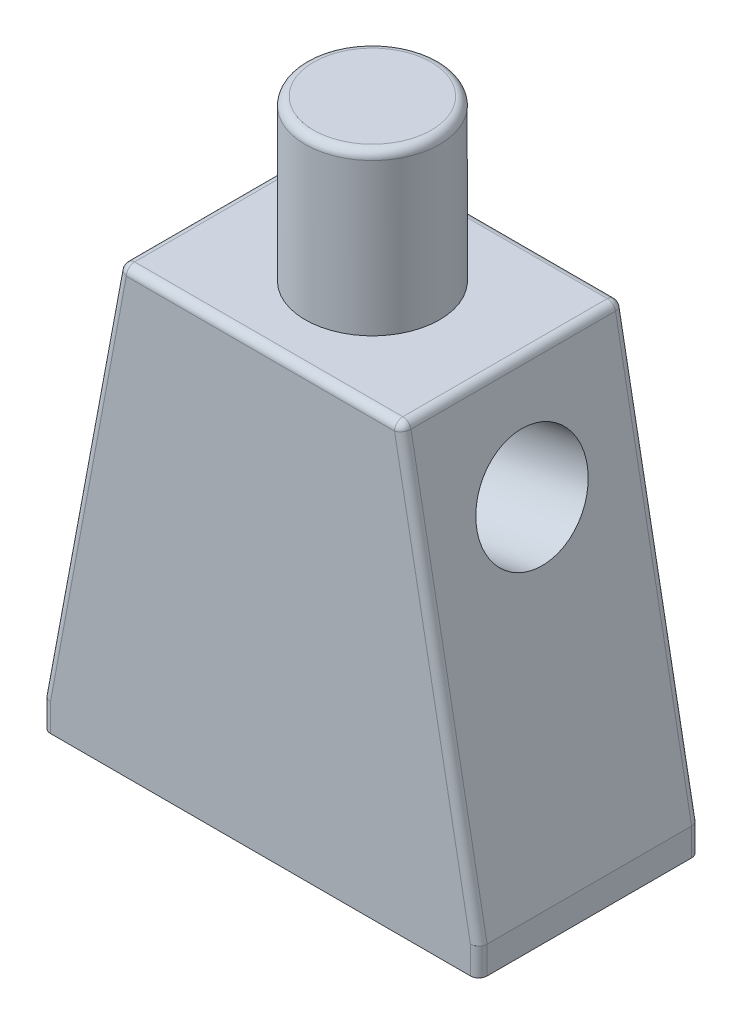
ISO-10303-21;
HEADER;
FILE_DESCRIPTION(('STEP AP214'),'2;1');
FILE_NAME('part.step','',(''),(''),'','','');
FILE_SCHEMA(('AUTOMOTIVE_DESIGN { 1 0 10303 214 1 1 1 1 }'));
ENDSEC;
DATA;
#1=APPLICATION_CONTEXT('core data for automotive mechanical design processes');
#2=APPLICATION_PROTOCOL_DEFINITION('international standard','automotive_design',2000,#1);
#3=PRODUCT_CONTEXT('',#1,'mechanical');
#4=PRODUCT('Part','Part','',(#3));
#5=PRODUCT_RELATED_PRODUCT_CATEGORY('part','',(#4));
#6=PRODUCT_DEFINITION_FORMATION('','',#4);
#7=PRODUCT_DEFINITION_CONTEXT('part definition',#1,'design');
#8=PRODUCT_DEFINITION('design','',#6,#7);
#9=PRODUCT_DEFINITION_SHAPE('','',#8);
#10=(LENGTH_UNIT() NAMED_UNIT(*) SI_UNIT(.MILLI.,.METRE.));
#11=(NAMED_UNIT(*) PLANE_ANGLE_UNIT() SI_UNIT($,.RADIAN.));
#12=(NAMED_UNIT(*) SI_UNIT($,.STERADIAN.) SOLID_ANGLE_UNIT());
#13=UNCERTAINTY_MEASURE_WITH_UNIT(LENGTH_MEASURE(1.E-05),#10,'distance_accuracy_value','');
#14=(GEOMETRIC_REPRESENTATION_CONTEXT(3) GLOBAL_UNCERTAINTY_ASSIGNED_CONTEXT((#13)) GLOBAL_UNIT_ASSIGNED_CONTEXT((#10,
#11,#12)) REPRESENTATION_CONTEXT('',''));
#15=CARTESIAN_POINT('',(0.,0.,0.));
#16=DIRECTION('',(0.,0.,1.));
#17=DIRECTION('',(1.,0.,0.));
#18=AXIS2_PLACEMENT_3D('',#15,#16,#17);
#19=CARTESIAN_POINT('',(200.66,-267.037594936709,203.2));
#20=DIRECTION('',(-0.98302024876546,-0.183497113102886,0.));
#21=DIRECTION('',(0.183497113102886,-0.98302024876546,0.));
#22=AXIS2_PLACEMENT_3D('',#19,#20,#21);
#23=PLANE('',#22);
#24=CARTESIAN_POINT('',(147.946452395732,15.3564100861572,101.6));
#25=DIRECTION('',(0.98302024876546,0.183497113102886,0.));
#26=DIRECTION('',(-0.183497113102886,0.98302024876546,0.));
#27=AXIS2_PLACEMENT_3D('',#24,#25,#26);
#28=CIRCLE('',#27,50.8);
#29=CARTESIAN_POINT('',(138.624799050105,65.2938387234426,101.6));
#30=VERTEX_POINT('',#29);
#31=EDGE_CURVE('E315',#30,#30,#28,.T.);
#32=ORIENTED_EDGE('',*,*,#31,.F.);
#33=EDGE_LOOP('',(#32));
#34=FACE_BOUND('',#33,.T.);
#35=DIRECTION('',(0.,0.,-1.));
#36=VECTOR('',#35,1.);
#37=CARTESIAN_POINT('',(200.66,-267.037594936709,203.2));
#38=LINE('',#37,#36);
#39=CARTESIAN_POINT('',(200.66,-267.037594936709,195.58));
#40=VERTEX_POINT('',#39);
#41=CARTESIAN_POINT('',(200.66,-267.037594936709,7.61999999999999));
#42=VERTEX_POINT('',#41);
#43=EDGE_CURVE('E240',#40,#42,#38,.T.);
#44=ORIENTED_EDGE('',*,*,#43,.T.);
#45=DIRECTION('',(-0.183497113102886,0.98302024876546,0.));
#46=VECTOR('',#45,1.);
#47=CARTESIAN_POINT('',(200.66,-267.037594936709,7.61999999999999));
#48=LINE('',#47,#46);
#49=CARTESIAN_POINT('',(130.701393706322,107.740653065135,7.61999999999999));
#50=VERTEX_POINT('',#49);
#51=EDGE_CURVE('E336',#42,#50,#48,.T.);
#52=ORIENTED_EDGE('',*,*,#51,.T.);
#53=DIRECTION('',(0.,0.,-1.));
#54=VECTOR('',#53,1.);
#55=CARTESIAN_POINT('',(130.701393706322,107.740653065135,203.2));
#56=LINE('',#55,#54);
#57=CARTESIAN_POINT('',(130.701393706322,107.740653065135,195.58));
#58=VERTEX_POINT('',#57);
#59=EDGE_CURVE('E331',#50,#58,#56,.F.);
#60=ORIENTED_EDGE('',*,*,#59,.T.);
#61=DIRECTION('',(-0.183497113102886,0.98302024876546,0.));
#62=VECTOR('',#61,1.);
#63=CARTESIAN_POINT('',(200.66,-267.037594936709,195.58));
#64=LINE('',#63,#62);
#65=EDGE_CURVE('E333',#58,#40,#64,.F.);
#66=ORIENTED_EDGE('',*,*,#65,.T.);
#67=EDGE_LOOP('',(#44,#52,#60,#66));
#68=FACE_BOUND('',#67,.T.);
#69=ADVANCED_FACE('F33',(#34,#68),#23,.F.);
#70=CARTESIAN_POINT('',(129.54,113.962405063291,203.2));
#71=DIRECTION('',(0.,-1.,0.));
#72=DIRECTION('',(1.,0.,0.));
#73=AXIS2_PLACEMENT_3D('',#70,#71,#72);
#74=PLANE('',#73);
#75=CARTESIAN_POINT('',(1.29077941072965,113.962405063291,101.591800301564));
#76=DIRECTION('',(0.,-1.,0.));
#77=DIRECTION('',(1.,0.,0.));
#78=AXIS2_PLACEMENT_3D('',#75,#76,#77);
#79=CIRCLE('',#78,61.722);
#80=CARTESIAN_POINT('',(63.0127794107296,113.962405063291,101.591800301564));
#81=VERTEX_POINT('',#80);
#82=EDGE_CURVE('E206',#81,#81,#79,.F.);
#83=ORIENTED_EDGE('',*,*,#82,.F.);
#84=EDGE_LOOP('',(#83));
#85=FACE_BOUND('',#84,.T.);
#86=DIRECTION('',(-1.,0.,0.));
#87=VECTOR('',#86,1.);
#88=CARTESIAN_POINT('',(129.54,113.962405063291,195.58));
#89=LINE('',#88,#87);
#90=CARTESIAN_POINT('',(-123.21077941073,113.962405063291,195.58));
#91=VERTEX_POINT('',#90);
#92=CARTESIAN_POINT('',(123.21077941073,113.962405063291,195.58));
#93=VERTEX_POINT('',#92);
#94=EDGE_CURVE('E197',#91,#93,#89,.F.);
#95=ORIENTED_EDGE('',*,*,#94,.T.);
#96=DIRECTION('',(0.,0.,-1.));
#97=VECTOR('',#96,1.);
#98=CARTESIAN_POINT('',(123.21077941073,113.962405063291,203.2));
#99=LINE('',#98,#97);
#100=CARTESIAN_POINT('',(123.21077941073,113.962405063291,7.61999999999999));
#101=VERTEX_POINT('',#100);
#102=EDGE_CURVE('E203',#93,#101,#99,.T.);
#103=ORIENTED_EDGE('',*,*,#102,.T.);
#104=DIRECTION('',(-1.,0.,0.));
#105=VECTOR('',#104,1.);
#106=CARTESIAN_POINT('',(129.54,113.962405063291,7.61999999999999));
#107=LINE('',#106,#105);
#108=CARTESIAN_POINT('',(-123.21077941073,113.962405063291,7.61999999999999));
#109=VERTEX_POINT('',#108);
#110=EDGE_CURVE('E201',#101,#109,#107,.T.);
#111=ORIENTED_EDGE('',*,*,#110,.T.);
#112=DIRECTION('',(0.,0.,-1.));
#113=VECTOR('',#112,1.);
#114=CARTESIAN_POINT('',(-123.21077941073,113.962405063291,203.2));
#115=LINE('',#114,#113);
#116=EDGE_CURVE('E199',#109,#91,#115,.F.);
#117=ORIENTED_EDGE('',*,*,#116,.T.);
#118=EDGE_LOOP('',(#95,#103,#111,#117));
#119=FACE_BOUND('',#118,.T.);
#120=ADVANCED_FACE('F394',(#85,#119),#74,.F.);
#121=CARTESIAN_POINT('',(-129.54,113.962405063291,203.2));
#122=DIRECTION('',(0.98302024876546,-0.183497113102886,0.));
#123=DIRECTION('',(0.183497113102886,0.98302024876546,0.));
#124=AXIS2_PLACEMENT_3D('',#121,#122,#123);
#125=PLANE('',#124);
#126=CARTESIAN_POINT('',(-147.946452395732,15.3564100861572,101.6));
#127=DIRECTION('',(-0.98302024876546,0.183497113102886,0.));
#128=DIRECTION('',(-0.183497113102886,-0.98302024876546,0.));
#129=AXIS2_PLACEMENT_3D('',#126,#127,#128);
#130=CIRCLE('',#129,50.8);
#131=CARTESIAN_POINT('',(-157.268105741358,-34.5810185511282,101.6));
#132=VERTEX_POINT('',#131);
#133=EDGE_CURVE('E304',#132,#132,#130,.T.);
#134=ORIENTED_EDGE('',*,*,#133,.F.);
#135=EDGE_LOOP('',(#134));
#136=FACE_BOUND('',#135,.T.);
#137=DIRECTION('',(0.,0.,-1.));
#138=VECTOR('',#137,1.);
#139=CARTESIAN_POINT('',(-130.701393706322,107.740653065135,203.2));
#140=LINE('',#139,#138);
#141=CARTESIAN_POINT('',(-130.701393706322,107.740653065135,195.58));
#142=VERTEX_POINT('',#141);
#143=CARTESIAN_POINT('',(-130.701393706322,107.740653065135,7.61999999999999));
#144=VERTEX_POINT('',#143);
#145=EDGE_CURVE('E191',#142,#144,#140,.T.);
#146=ORIENTED_EDGE('',*,*,#145,.T.);
#147=DIRECTION('',(-0.183497113102886,-0.98302024876546,0.));
#148=VECTOR('',#147,1.);
#149=CARTESIAN_POINT('',(-129.54,113.962405063291,7.61999999999999));
#150=LINE('',#149,#148);
#151=CARTESIAN_POINT('',(-200.66,-267.037594936709,7.61999999999999));
#152=VERTEX_POINT('',#151);
#153=EDGE_CURVE('E195',#144,#152,#150,.T.);
#154=ORIENTED_EDGE('',*,*,#153,.T.);
#155=DIRECTION('',(0.,0.,-1.));
#156=VECTOR('',#155,1.);
#157=CARTESIAN_POINT('',(-200.66,-267.037594936709,203.2));
#158=LINE('',#157,#156);
#159=CARTESIAN_POINT('',(-200.66,-267.037594936709,195.58));
#160=VERTEX_POINT('',#159);
#161=EDGE_CURVE('E329',#160,#152,#158,.T.);
#162=ORIENTED_EDGE('',*,*,#161,.F.);
#163=DIRECTION('',(-0.183497113102886,-0.98302024876546,0.));
#164=VECTOR('',#163,1.);
#165=CARTESIAN_POINT('',(-129.54,113.962405063291,195.58));
#166=LINE('',#165,#164);
#167=EDGE_CURVE('E193',#160,#142,#166,.F.);
#168=ORIENTED_EDGE('',*,*,#167,.T.);
#169=EDGE_LOOP('',(#146,#154,#162,#168));
#170=FACE_BOUND('',#169,.T.);
#171=ADVANCED_FACE('F400',(#136,#170),#125,.F.);
#172=CARTESIAN_POINT('',(0.,0.,203.2));
#173=DIRECTION('',(0.,0.,1.));
#174=DIRECTION('',(1.,0.,0.));
#175=AXIS2_PLACEMENT_3D('',#172,#173,#174);
#176=PLANE('',#175);
#177=DIRECTION('',(-1.,0.,0.));
#178=VECTOR('',#177,1.);
#179=CARTESIAN_POINT('',(-200.66,-292.437594936709,203.2));
#180=LINE('',#179,#178);
#181=CARTESIAN_POINT('',(193.04,-292.437594936709,203.2));
#182=VERTEX_POINT('',#181);
#183=CARTESIAN_POINT('',(-193.04,-292.437594936709,203.2));
#184=VERTEX_POINT('',#183);
#185=EDGE_CURVE('E301',#182,#184,#180,.T.);
#186=ORIENTED_EDGE('',*,*,#185,.F.);
#187=DIRECTION('',(0.,1.,0.));
#188=VECTOR('',#187,1.);
#189=CARTESIAN_POINT('',(193.04,-267.037594936709,203.2));
#190=LINE('',#189,#188);
#191=CARTESIAN_POINT('',(193.04,-267.037594936709,203.2));
#192=VERTEX_POINT('',#191);
#193=EDGE_CURVE('E268',#182,#192,#190,.T.);
#194=ORIENTED_EDGE('',*,*,#193,.T.);
#195=DIRECTION('',(-1.,0.,0.));
#196=VECTOR('',#195,1.);
#197=CARTESIAN_POINT('',(-200.66,-267.037594936709,203.2));
#198=LINE('',#197,#196);
#199=CARTESIAN_POINT('',(192.90837941073,-267.037594936709,203.2));
#200=VERTEX_POINT('',#199);
#201=EDGE_CURVE('E310',#192,#200,#198,.T.);
#202=ORIENTED_EDGE('',*,*,#201,.T.);
#203=DIRECTION('',(-0.183497113102886,0.98302024876546,0.));
#204=VECTOR('',#203,1.);
#205=CARTESIAN_POINT('',(122.049385704407,112.564157061447,203.2));
#206=LINE('',#205,#204);
#207=CARTESIAN_POINT('',(123.21077941073,106.342405063291,203.2));
#208=VERTEX_POINT('',#207);
#209=EDGE_CURVE('E189',#200,#208,#206,.T.);
#210=ORIENTED_EDGE('',*,*,#209,.T.);
#211=DIRECTION('',(-1.,0.,0.));
#212=VECTOR('',#211,1.);
#213=CARTESIAN_POINT('',(-129.54,106.342405063291,203.2));
#214=LINE('',#213,#212);
#215=CARTESIAN_POINT('',(-123.21077941073,106.342405063291,203.2));
#216=VERTEX_POINT('',#215);
#217=EDGE_CURVE('E185',#208,#216,#214,.T.);
#218=ORIENTED_EDGE('',*,*,#217,.T.);
#219=DIRECTION('',(-0.183497113102886,-0.98302024876546,0.));
#220=VECTOR('',#219,1.);
#221=CARTESIAN_POINT('',(-193.169385704407,-268.435842938553,203.2));
#222=LINE('',#221,#220);
#223=CARTESIAN_POINT('',(-192.90837941073,-267.037594936709,203.2));
#224=VERTEX_POINT('',#223);
#225=EDGE_CURVE('E187',#216,#224,#222,.T.);
#226=ORIENTED_EDGE('',*,*,#225,.T.);
#227=CARTESIAN_POINT('',(-193.04,-267.037594936709,203.2));
#228=VERTEX_POINT('',#227);
#229=EDGE_CURVE('E156',#224,#228,#198,.T.);
#230=ORIENTED_EDGE('',*,*,#229,.T.);
#231=DIRECTION('',(0.,1.,0.));
#232=VECTOR('',#231,1.);
#233=CARTESIAN_POINT('',(-193.04,-292.437594936709,203.2));
#234=LINE('',#233,#232);
#235=EDGE_CURVE('E266',#228,#184,#234,.F.);
#236=ORIENTED_EDGE('',*,*,#235,.T.);
#237=EDGE_LOOP('',(#186,#194,#202,#210,#218,#226,#230,#236));
#238=FACE_BOUND('',#237,.T.);
#239=ADVANCED_FACE('F363',(#238),#176,.T.);
#240=CARTESIAN_POINT('',(0.,0.,0.));
#241=DIRECTION('',(0.,0.,1.));
#242=DIRECTION('',(1.,0.,0.));
#243=AXIS2_PLACEMENT_3D('',#240,#241,#242);
#244=PLANE('',#243);
#245=DIRECTION('',(1.,0.,0.));
#246=VECTOR('',#245,1.);
#247=CARTESIAN_POINT('',(-200.66,-292.437594936709,0.));
#248=LINE('',#247,#246);
#249=CARTESIAN_POINT('',(-193.04,-292.437594936709,0.));
#250=VERTEX_POINT('',#249);
#251=CARTESIAN_POINT('',(193.04,-292.437594936709,0.));
#252=VERTEX_POINT('',#251);
#253=EDGE_CURVE('E296',#250,#252,#248,.T.);
#254=ORIENTED_EDGE('',*,*,#253,.F.);
#255=DIRECTION('',(0.,1.,0.));
#256=VECTOR('',#255,1.);
#257=CARTESIAN_POINT('',(-193.04,0.,0.));
#258=LINE('',#257,#256);
#259=CARTESIAN_POINT('',(-193.04,-267.037594936709,0.));
#260=VERTEX_POINT('',#259);
#261=EDGE_CURVE('E153',#250,#260,#258,.T.);
#262=ORIENTED_EDGE('',*,*,#261,.T.);
#263=DIRECTION('',(1.,0.,0.));
#264=VECTOR('',#263,1.);
#265=CARTESIAN_POINT('',(-200.66,-267.037594936709,0.));
#266=LINE('',#265,#264);
#267=CARTESIAN_POINT('',(-192.90837941073,-267.037594936709,0.));
#268=VERTEX_POINT('',#267);
#269=EDGE_CURVE('E146',#260,#268,#266,.T.);
#270=ORIENTED_EDGE('',*,*,#269,.T.);
#271=DIRECTION('',(-0.183497113102886,-0.98302024876546,0.));
#272=VECTOR('',#271,1.);
#273=CARTESIAN_POINT('',(-138.244315324138,25.8056055271725,0.));
#274=LINE('',#273,#272);
#275=CARTESIAN_POINT('',(-123.21077941073,106.342405063291,0.));
#276=VERTEX_POINT('',#275);
#277=EDGE_CURVE('E150',#268,#276,#274,.F.);
#278=ORIENTED_EDGE('',*,*,#277,.T.);
#279=DIRECTION('',(-1.,0.,0.));
#280=VECTOR('',#279,1.);
#281=CARTESIAN_POINT('',(0.,106.342405063291,0.));
#282=LINE('',#281,#280);
#283=CARTESIAN_POINT('',(123.21077941073,106.342405063291,0.));
#284=VERTEX_POINT('',#283);
#285=EDGE_CURVE('E169',#276,#284,#282,.F.);
#286=ORIENTED_EDGE('',*,*,#285,.T.);
#287=DIRECTION('',(-0.183497113102886,0.98302024876546,0.));
#288=VECTOR('',#287,1.);
#289=CARTESIAN_POINT('',(138.244315324138,25.8056055271725,0.));
#290=LINE('',#289,#288);
#291=CARTESIAN_POINT('',(192.90837941073,-267.037594936709,0.));
#292=VERTEX_POINT('',#291);
#293=EDGE_CURVE('E168',#284,#292,#290,.F.);
#294=ORIENTED_EDGE('',*,*,#293,.T.);
#295=CARTESIAN_POINT('',(193.04,-267.037594936709,0.));
#296=VERTEX_POINT('',#295);
#297=EDGE_CURVE('E157',#292,#296,#266,.T.);
#298=ORIENTED_EDGE('',*,*,#297,.T.);
#299=DIRECTION('',(0.,1.,0.));
#300=VECTOR('',#299,1.);
#301=CARTESIAN_POINT('',(193.04,0.,0.));
#302=LINE('',#301,#300);
#303=EDGE_CURVE('E249',#296,#252,#302,.F.);
#304=ORIENTED_EDGE('',*,*,#303,.T.);
#305=EDGE_LOOP('',(#254,#262,#270,#278,#286,#294,#298,#304));
#306=FACE_BOUND('',#305,.T.);
#307=ADVANCED_FACE('F149',(#306),#244,.F.);
#308=CARTESIAN_POINT('',(-138.244315324138,25.8056055271725,195.58));
#309=DIRECTION('',(0.183497113102886,0.98302024876546,0.));
#310=DIRECTION('',(-0.98302024876546,0.183497113102886,0.));
#311=AXIS2_PLACEMENT_3D('',#308,#309,#310);
#312=CYLINDRICAL_SURFACE('',#311,7.62);
#313=CARTESIAN_POINT('',(-123.21077941073,106.342405063291,195.58));
#314=DIRECTION('',(0.183497113102885,0.98302024876546,0.));
#315=DIRECTION('',(-0.98302024876546,0.183497113102885,0.));
#316=AXIS2_PLACEMENT_3D('',#313,#314,#315);
#317=CIRCLE('',#316,7.62);
#318=EDGE_CURVE('E237',#142,#216,#317,.T.);
#319=ORIENTED_EDGE('',*,*,#318,.F.);
#320=ORIENTED_EDGE('',*,*,#167,.F.);
#321=CARTESIAN_POINT('',(-192.90837941073,-267.037594936709,195.58));
#322=DIRECTION('',(0.,1.,0.));
#323=DIRECTION('',(1.,0.,0.));
#324=AXIS2_PLACEMENT_3D('',#321,#322,#323);
#325=ELLIPSE('',#324,7.75162058927035,7.62);
#326=EDGE_CURVE('E175',#224,#160,#325,.F.);
#327=ORIENTED_EDGE('',*,*,#326,.F.);
#328=ORIENTED_EDGE('',*,*,#225,.F.);
#329=EDGE_LOOP('',(#319,#320,#327,#328));
#330=FACE_BOUND('',#329,.T.);
#331=ADVANCED_FACE('F440',(#330),#312,.T.);
#332=CARTESIAN_POINT('',(-123.21077941073,106.342405063291,195.58));
#333=DIRECTION('',(0.,0.,1.));
#334=DIRECTION('',(1.,0.,0.));
#335=AXIS2_PLACEMENT_3D('',#332,#333,#334);
#336=SPHERICAL_SURFACE('',#335,7.62);
#337=CARTESIAN_POINT('',(-123.21077941073,106.342405063291,195.58));
#338=DIRECTION('',(0.,0.,1.));
#339=DIRECTION('',(1.,0.,0.));
#340=AXIS2_PLACEMENT_3D('',#337,#338,#339);
#341=CIRCLE('',#340,7.62);
#342=EDGE_CURVE('E231',#142,#91,#341,.F.);
#343=ORIENTED_EDGE('',*,*,#342,.F.);
#344=ORIENTED_EDGE('',*,*,#318,.T.);
#345=CARTESIAN_POINT('',(-123.21077941073,106.342405063291,195.58));
#346=DIRECTION('',(-1.,0.,0.));
#347=DIRECTION('',(0.,0.,1.));
#348=AXIS2_PLACEMENT_3D('',#345,#346,#347);
#349=CIRCLE('',#348,7.62);
#350=EDGE_CURVE('E234',#91,#216,#349,.F.);
#351=ORIENTED_EDGE('',*,*,#350,.F.);
#352=EDGE_LOOP('',(#343,#344,#351));
#353=FACE_BOUND('',#352,.T.);
#354=ADVANCED_FACE('F436',(#353),#336,.T.);
#355=CARTESIAN_POINT('',(138.244315324138,25.8056055271725,195.58));
#356=DIRECTION('',(0.183497113102886,-0.98302024876546,0.));
#357=DIRECTION('',(0.98302024876546,0.183497113102886,0.));
#358=AXIS2_PLACEMENT_3D('',#355,#356,#357);
#359=CYLINDRICAL_SURFACE('',#358,7.62);
#360=CARTESIAN_POINT('',(192.90837941073,-267.037594936709,195.58));
#361=DIRECTION('',(0.,1.,0.));
#362=DIRECTION('',(1.,0.,0.));
#363=AXIS2_PLACEMENT_3D('',#360,#361,#362);
#364=ELLIPSE('',#363,7.75162058927035,7.62);
#365=EDGE_CURVE('E174',#40,#200,#364,.F.);
#366=ORIENTED_EDGE('',*,*,#365,.F.);
#367=ORIENTED_EDGE('',*,*,#65,.F.);
#368=CARTESIAN_POINT('',(123.21077941073,106.342405063291,195.58));
#369=DIRECTION('',(-0.183497113102883,0.98302024876546,0.));
#370=DIRECTION('',(-0.98302024876546,-0.183497113102883,0.));
#371=AXIS2_PLACEMENT_3D('',#368,#369,#370);
#372=CIRCLE('',#371,7.62);
#373=EDGE_CURVE('E228',#208,#58,#372,.T.);
#374=ORIENTED_EDGE('',*,*,#373,.F.);
#375=ORIENTED_EDGE('',*,*,#209,.F.);
#376=EDGE_LOOP('',(#366,#367,#374,#375));
#377=FACE_BOUND('',#376,.T.);
#378=ADVANCED_FACE('F432',(#377),#359,.T.);
#379=CARTESIAN_POINT('',(0.,106.342405063291,195.58));
#380=DIRECTION('',(1.,0.,0.));
#381=DIRECTION('',(0.,1.,0.));
#382=AXIS2_PLACEMENT_3D('',#379,#380,#381);
#383=CYLINDRICAL_SURFACE('',#382,7.62);
#384=ORIENTED_EDGE('',*,*,#350,.T.);
#385=ORIENTED_EDGE('',*,*,#217,.F.);
#386=CARTESIAN_POINT('',(123.21077941073,106.342405063291,195.58));
#387=DIRECTION('',(1.,0.,0.));
#388=DIRECTION('',(0.,0.,-1.));
#389=AXIS2_PLACEMENT_3D('',#386,#387,#388);
#390=CIRCLE('',#389,7.62);
#391=EDGE_CURVE('E225',#93,#208,#390,.T.);
#392=ORIENTED_EDGE('',*,*,#391,.F.);
#393=ORIENTED_EDGE('',*,*,#94,.F.);
#394=EDGE_LOOP('',(#384,#385,#392,#393));
#395=FACE_BOUND('',#394,.T.);
#396=ADVANCED_FACE('F428',(#395),#383,.T.);
#397=CARTESIAN_POINT('',(-123.21077941073,106.342405063291,203.2));
#398=DIRECTION('',(0.,0.,-1.));
#399=DIRECTION('',(-1.,0.,0.));
#400=AXIS2_PLACEMENT_3D('',#397,#398,#399);
#401=CYLINDRICAL_SURFACE('',#400,7.62);
#402=ORIENTED_EDGE('',*,*,#342,.T.);
#403=ORIENTED_EDGE('',*,*,#116,.F.);
#404=CARTESIAN_POINT('',(-123.21077941073,106.342405063291,7.61999999999999));
#405=DIRECTION('',(0.,0.,-1.));
#406=DIRECTION('',(-1.,0.,0.));
#407=AXIS2_PLACEMENT_3D('',#404,#405,#406);
#408=CIRCLE('',#407,7.62);
#409=EDGE_CURVE('E222',#144,#109,#408,.T.);
#410=ORIENTED_EDGE('',*,*,#409,.F.);
#411=ORIENTED_EDGE('',*,*,#145,.F.);
#412=EDGE_LOOP('',(#402,#403,#410,#411));
#413=FACE_BOUND('',#412,.T.);
#414=ADVANCED_FACE('F425',(#413),#401,.T.);
#415=CARTESIAN_POINT('',(-122.049385704407,112.564157061447,7.61999999999999));
#416=DIRECTION('',(-0.183497113102886,-0.98302024876546,0.));
#417=DIRECTION('',(0.98302024876546,-0.183497113102886,0.));
#418=AXIS2_PLACEMENT_3D('',#415,#416,#417);
#419=CYLINDRICAL_SURFACE('',#418,7.62);
#420=CARTESIAN_POINT('',(-192.90837941073,-267.037594936709,7.61999999999999));
#421=DIRECTION('',(0.,1.,0.));
#422=DIRECTION('',(-1.,0.,0.));
#423=AXIS2_PLACEMENT_3D('',#420,#421,#422);
#424=ELLIPSE('',#423,7.75162058927035,7.62);
#425=EDGE_CURVE('E163',#152,#268,#424,.F.);
#426=ORIENTED_EDGE('',*,*,#425,.F.);
#427=ORIENTED_EDGE('',*,*,#153,.F.);
#428=CARTESIAN_POINT('',(-123.21077941073,106.342405063291,7.62));
#429=DIRECTION('',(0.183497113102886,0.98302024876546,0.));
#430=DIRECTION('',(-0.98302024876546,0.183497113102886,0.));
#431=AXIS2_PLACEMENT_3D('',#428,#429,#430);
#432=CIRCLE('',#431,7.62);
#433=EDGE_CURVE('E166',#276,#144,#432,.T.);
#434=ORIENTED_EDGE('',*,*,#433,.F.);
#435=ORIENTED_EDGE('',*,*,#277,.F.);
#436=EDGE_LOOP('',(#426,#427,#434,#435));
#437=FACE_BOUND('',#436,.T.);
#438=ADVANCED_FACE('F161',(#437),#419,.T.);
#439=CARTESIAN_POINT('',(123.21077941073,106.342405063291,195.58));
#440=DIRECTION('',(0.,0.,1.));
#441=DIRECTION('',(1.,0.,0.));
#442=AXIS2_PLACEMENT_3D('',#439,#440,#441);
#443=SPHERICAL_SURFACE('',#442,7.62);
#444=ORIENTED_EDGE('',*,*,#391,.T.);
#445=ORIENTED_EDGE('',*,*,#373,.T.);
#446=CARTESIAN_POINT('',(123.21077941073,106.342405063291,195.58));
#447=DIRECTION('',(0.,0.,1.));
#448=DIRECTION('',(1.,0.,0.));
#449=AXIS2_PLACEMENT_3D('',#446,#447,#448);
#450=CIRCLE('',#449,7.62);
#451=EDGE_CURVE('E218',#93,#58,#450,.F.);
#452=ORIENTED_EDGE('',*,*,#451,.F.);
#453=EDGE_LOOP('',(#444,#445,#452));
#454=FACE_BOUND('',#453,.T.);
#455=ADVANCED_FACE('F418',(#454),#443,.T.);
#456=CARTESIAN_POINT('',(-123.21077941073,106.342405063291,7.62));
#457=DIRECTION('',(0.,0.,1.));
#458=DIRECTION('',(1.,0.,0.));
#459=AXIS2_PLACEMENT_3D('',#456,#457,#458);
#460=SPHERICAL_SURFACE('',#459,7.62);
#461=ORIENTED_EDGE('',*,*,#433,.T.);
#462=ORIENTED_EDGE('',*,*,#409,.T.);
#463=CARTESIAN_POINT('',(-123.21077941073,106.342405063291,7.61999999999999));
#464=DIRECTION('',(-1.,0.,0.));
#465=DIRECTION('',(0.,0.,1.));
#466=AXIS2_PLACEMENT_3D('',#463,#464,#465);
#467=CIRCLE('',#466,7.62);
#468=EDGE_CURVE('E215',#276,#109,#467,.F.);
#469=ORIENTED_EDGE('',*,*,#468,.F.);
#470=EDGE_LOOP('',(#461,#462,#469));
#471=FACE_BOUND('',#470,.T.);
#472=ADVANCED_FACE('F415',(#471),#460,.T.);
#473=CARTESIAN_POINT('',(123.21077941073,106.342405063291,203.2));
#474=DIRECTION('',(0.,0.,-1.));
#475=DIRECTION('',(-1.,0.,0.));
#476=AXIS2_PLACEMENT_3D('',#473,#474,#475);
#477=CYLINDRICAL_SURFACE('',#476,7.62);
#478=ORIENTED_EDGE('',*,*,#451,.T.);
#479=ORIENTED_EDGE('',*,*,#59,.F.);
#480=CARTESIAN_POINT('',(123.21077941073,106.342405063291,7.61999999999999));
#481=DIRECTION('',(0.,0.,-1.));
#482=DIRECTION('',(-1.,0.,0.));
#483=AXIS2_PLACEMENT_3D('',#480,#481,#482);
#484=CIRCLE('',#483,7.62);
#485=EDGE_CURVE('E212',#101,#50,#484,.T.);
#486=ORIENTED_EDGE('',*,*,#485,.F.);
#487=ORIENTED_EDGE('',*,*,#102,.F.);
#488=EDGE_LOOP('',(#478,#479,#486,#487));
#489=FACE_BOUND('',#488,.T.);
#490=ADVANCED_FACE('F354',(#489),#477,.T.);
#491=CARTESIAN_POINT('',(129.54,106.342405063291,7.61999999999999));
#492=DIRECTION('',(-1.,0.,0.));
#493=DIRECTION('',(0.,-1.,0.));
#494=AXIS2_PLACEMENT_3D('',#491,#492,#493);
#495=CYLINDRICAL_SURFACE('',#494,7.62);
#496=ORIENTED_EDGE('',*,*,#468,.T.);
#497=ORIENTED_EDGE('',*,*,#110,.F.);
#498=CARTESIAN_POINT('',(123.21077941073,106.342405063291,7.62));
#499=DIRECTION('',(1.,0.,0.));
#500=DIRECTION('',(0.,0.,-1.));
#501=AXIS2_PLACEMENT_3D('',#498,#499,#500);
#502=CIRCLE('',#501,7.62);
#503=EDGE_CURVE('E209',#284,#101,#502,.T.);
#504=ORIENTED_EDGE('',*,*,#503,.F.);
#505=ORIENTED_EDGE('',*,*,#285,.F.);
#506=EDGE_LOOP('',(#496,#497,#504,#505));
#507=FACE_BOUND('',#506,.T.);
#508=ADVANCED_FACE('F343',(#507),#495,.T.);
#509=CARTESIAN_POINT('',(123.21077941073,106.342405063291,7.62));
#510=DIRECTION('',(0.,0.,1.));
#511=DIRECTION('',(1.,0.,0.));
#512=AXIS2_PLACEMENT_3D('',#509,#510,#511);
#513=SPHERICAL_SURFACE('',#512,7.62);
#514=ORIENTED_EDGE('',*,*,#503,.T.);
#515=ORIENTED_EDGE('',*,*,#485,.T.);
#516=CARTESIAN_POINT('',(123.21077941073,106.342405063291,7.61999999999999));
#517=DIRECTION('',(-0.183497113102885,0.98302024876546,0.));
#518=DIRECTION('',(-0.98302024876546,-0.183497113102885,0.));
#519=AXIS2_PLACEMENT_3D('',#516,#517,#518);
#520=CIRCLE('',#519,7.62);
#521=EDGE_CURVE('E207',#284,#50,#520,.F.);
#522=ORIENTED_EDGE('',*,*,#521,.F.);
#523=EDGE_LOOP('',(#514,#515,#522));
#524=FACE_BOUND('',#523,.T.);
#525=ADVANCED_FACE('F350',(#524),#513,.T.);
#526=CARTESIAN_POINT('',(193.169385704407,-268.435842938553,7.61999999999999));
#527=DIRECTION('',(-0.183497113102886,0.98302024876546,0.));
#528=DIRECTION('',(-0.98302024876546,-0.183497113102886,0.));
#529=AXIS2_PLACEMENT_3D('',#526,#527,#528);
#530=CYLINDRICAL_SURFACE('',#529,7.62);
#531=CARTESIAN_POINT('',(192.90837941073,-267.037594936709,7.61999999999999));
#532=DIRECTION('',(0.,1.,0.));
#533=DIRECTION('',(-1.,0.,0.));
#534=AXIS2_PLACEMENT_3D('',#531,#532,#533);
#535=ELLIPSE('',#534,7.75162058927035,7.62);
#536=EDGE_CURVE('E178',#292,#42,#535,.F.);
#537=ORIENTED_EDGE('',*,*,#536,.F.);
#538=ORIENTED_EDGE('',*,*,#293,.F.);
#539=ORIENTED_EDGE('',*,*,#521,.T.);
#540=ORIENTED_EDGE('',*,*,#51,.F.);
#541=EDGE_LOOP('',(#537,#538,#539,#540));
#542=FACE_BOUND('',#541,.T.);
#543=ADVANCED_FACE('F348',(#542),#530,.T.);
#544=CARTESIAN_POINT('',(1.29077941072962,261.104605063291,101.591800301564));
#545=DIRECTION('',(0.,-1.,0.));
#546=DIRECTION('',(1.,0.,0.));
#547=AXIS2_PLACEMENT_3D('',#544,#545,#546);
#548=CYLINDRICAL_SURFACE('',#547,61.722);
#549=CARTESIAN_POINT('',(1.29077941072962,253.484605063291,101.591800301564));
#550=DIRECTION('',(0.,1.,0.));
#551=DIRECTION('',(-1.,0.,0.));
#552=AXIS2_PLACEMENT_3D('',#549,#550,#551);
#553=CIRCLE('',#552,61.722);
#554=CARTESIAN_POINT('',(-60.4312205892704,253.484605063291,101.591800301564));
#555=VERTEX_POINT('',#554);
#556=EDGE_CURVE('E246',#555,#555,#553,.F.);
#557=ORIENTED_EDGE('',*,*,#556,.T.);
#558=EDGE_LOOP('',(#557));
#559=FACE_BOUND('',#558,.T.);
#560=ORIENTED_EDGE('',*,*,#82,.T.);
#561=EDGE_LOOP('',(#560));
#562=FACE_BOUND('',#561,.T.);
#563=ADVANCED_FACE('F408',(#559,#562),#548,.T.);
#564=CARTESIAN_POINT('',(1.29077941072962,261.104605063291,101.591800301564));
#565=DIRECTION('',(0.,1.,0.));
#566=DIRECTION('',(-1.,0.,0.));
#567=AXIS2_PLACEMENT_3D('',#564,#565,#566);
#568=PLANE('',#567);
#569=CARTESIAN_POINT('',(1.29077941072962,261.104605063291,101.591800301564));
#570=DIRECTION('',(0.,1.,0.));
#571=DIRECTION('',(-1.,0.,0.));
#572=AXIS2_PLACEMENT_3D('',#569,#570,#571);
#573=CIRCLE('',#572,54.102);
#574=CARTESIAN_POINT('',(-52.8112205892704,261.104605063291,101.591800301564));
#575=VERTEX_POINT('',#574);
#576=EDGE_CURVE('E243',#575,#575,#573,.T.);
#577=ORIENTED_EDGE('',*,*,#576,.T.);
#578=EDGE_LOOP('',(#577));
#579=FACE_BOUND('',#578,.T.);
#580=ADVANCED_FACE('F449',(#579),#568,.T.);
#581=CARTESIAN_POINT('',(1.29077941072962,253.484605063291,101.591800301564));
#582=DIRECTION('',(0.,1.,0.));
#583=DIRECTION('',(-1.,0.,0.));
#584=AXIS2_PLACEMENT_3D('',#581,#582,#583);
#585=TOROIDAL_SURFACE('',#584,54.102,7.62);
#586=ORIENTED_EDGE('',*,*,#556,.F.);
#587=EDGE_LOOP('',(#586));
#588=FACE_BOUND('',#587,.T.);
#589=ORIENTED_EDGE('',*,*,#576,.F.);
#590=EDGE_LOOP('',(#589));
#591=FACE_BOUND('',#590,.T.);
#592=ADVANCED_FACE('F445',(#588,#591),#585,.T.);
#593=CARTESIAN_POINT('',(48.071595121161,-3.28689660509598,101.6));
#594=DIRECTION('',(0.98302024876546,0.183497113102886,0.));
#595=DIRECTION('',(-0.183497113102886,0.98302024876546,0.));
#596=AXIS2_PLACEMENT_3D('',#593,#594,#595);
#597=CYLINDRICAL_SURFACE('',#596,50.8);
#598=CARTESIAN_POINT('',(48.071595121161,-3.28689660509598,101.6));
#599=DIRECTION('',(0.98302024876546,0.183497113102886,0.));
#600=DIRECTION('',(-0.183497113102886,0.98302024876546,0.));
#601=AXIS2_PLACEMENT_3D('',#598,#599,#600);
#602=CIRCLE('',#601,50.8);
#603=CARTESIAN_POINT('',(38.7499417755343,46.6505320321894,101.6));
#604=VERTEX_POINT('',#603);
#605=EDGE_CURVE('E318',#604,#604,#602,.T.);
#606=ORIENTED_EDGE('',*,*,#605,.F.);
#607=EDGE_LOOP('',(#606));
#608=FACE_BOUND('',#607,.T.);
#609=ORIENTED_EDGE('',*,*,#31,.T.);
#610=EDGE_LOOP('',(#609));
#611=FACE_BOUND('',#610,.T.);
#612=ADVANCED_FACE('F448',(#608,#611),#597,.F.);
#613=CARTESIAN_POINT('',(48.071595121161,-3.28689660509598,101.6));
#614=DIRECTION('',(0.98302024876546,0.183497113102886,0.));
#615=DIRECTION('',(-0.183497113102886,0.98302024876546,0.));
#616=AXIS2_PLACEMENT_3D('',#613,#614,#615);
#617=PLANE('',#616);
#618=ORIENTED_EDGE('',*,*,#605,.T.);
#619=EDGE_LOOP('',(#618));
#620=FACE_BOUND('',#619,.T.);
#621=ADVANCED_FACE('F632',(#620),#617,.T.);
#622=CARTESIAN_POINT('',(-48.0715951211609,-3.28689660509604,101.6));
#623=DIRECTION('',(-0.98302024876546,0.183497113102886,0.));
#624=DIRECTION('',(-0.183497113102886,-0.98302024876546,0.));
#625=AXIS2_PLACEMENT_3D('',#622,#623,#624);
#626=CYLINDRICAL_SURFACE('',#625,50.8);
#627=CARTESIAN_POINT('',(-48.0715951211609,-3.28689660509604,101.6));
#628=DIRECTION('',(-0.98302024876546,0.183497113102886,0.));
#629=DIRECTION('',(-0.183497113102886,-0.98302024876546,0.));
#630=AXIS2_PLACEMENT_3D('',#627,#628,#629);
#631=CIRCLE('',#630,50.8);
#632=CARTESIAN_POINT('',(-57.3932484667875,-53.2243252423814,101.6));
#633=VERTEX_POINT('',#632);
#634=EDGE_CURVE('E312',#633,#633,#631,.T.);
#635=ORIENTED_EDGE('',*,*,#634,.F.);
#636=EDGE_LOOP('',(#635));
#637=FACE_BOUND('',#636,.T.);
#638=ORIENTED_EDGE('',*,*,#133,.T.);
#639=EDGE_LOOP('',(#638));
#640=FACE_BOUND('',#639,.T.);
#641=ADVANCED_FACE('F622',(#637,#640),#626,.F.);
#642=CARTESIAN_POINT('',(-48.0715951211609,-3.28689660509604,101.6));
#643=DIRECTION('',(-0.98302024876546,0.183497113102886,0.));
#644=DIRECTION('',(-0.183497113102886,-0.98302024876546,0.));
#645=AXIS2_PLACEMENT_3D('',#642,#643,#644);
#646=PLANE('',#645);
#647=ORIENTED_EDGE('',*,*,#634,.T.);
#648=EDGE_LOOP('',(#647));
#649=FACE_BOUND('',#648,.T.);
#650=ADVANCED_FACE('F533',(#649),#646,.T.);
#651=CARTESIAN_POINT('',(0.,-267.037594936709,0.));
#652=DIRECTION('',(0.,-1.,0.));
#653=DIRECTION('',(0.,0.,-1.));
#654=AXIS2_PLACEMENT_3D('',#651,#652,#653);
#655=PLANE('',#654);
#656=ORIENTED_EDGE('',*,*,#536,.T.);
#657=CARTESIAN_POINT('',(193.04,-267.037594936709,7.61999999999999));
#658=DIRECTION('',(0.,-1.,0.));
#659=DIRECTION('',(0.,0.,-1.));
#660=AXIS2_PLACEMENT_3D('',#657,#658,#659);
#661=CIRCLE('',#660,7.62);
#662=EDGE_CURVE('E41',#42,#296,#661,.F.);
#663=ORIENTED_EDGE('',*,*,#662,.T.);
#664=ORIENTED_EDGE('',*,*,#297,.F.);
#665=EDGE_LOOP('',(#656,#663,#664));
#666=FACE_BOUND('',#665,.T.);
#667=ADVANCED_FACE('F278',(#666),#655,.F.);
#668=ORIENTED_EDGE('',*,*,#201,.F.);
#669=CARTESIAN_POINT('',(193.04,-267.037594936709,195.58));
#670=DIRECTION('',(0.,-1.,0.));
#671=DIRECTION('',(0.,0.,-1.));
#672=AXIS2_PLACEMENT_3D('',#669,#670,#671);
#673=CIRCLE('',#672,7.62);
#674=EDGE_CURVE('E48',#192,#40,#673,.F.);
#675=ORIENTED_EDGE('',*,*,#674,.T.);
#676=ORIENTED_EDGE('',*,*,#365,.T.);
#677=EDGE_LOOP('',(#668,#675,#676));
#678=FACE_BOUND('',#677,.T.);
#679=ADVANCED_FACE('F391',(#678),#655,.F.);
#680=ORIENTED_EDGE('',*,*,#326,.T.);
#681=CARTESIAN_POINT('',(-193.04,-267.037594936709,195.58));
#682=DIRECTION('',(0.,-1.,0.));
#683=DIRECTION('',(0.,0.,-1.));
#684=AXIS2_PLACEMENT_3D('',#681,#682,#683);
#685=CIRCLE('',#684,7.62);
#686=EDGE_CURVE('E11',#160,#228,#685,.F.);
#687=ORIENTED_EDGE('',*,*,#686,.T.);
#688=ORIENTED_EDGE('',*,*,#229,.F.);
#689=EDGE_LOOP('',(#680,#687,#688));
#690=FACE_BOUND('',#689,.T.);
#691=ADVANCED_FACE('F383',(#690),#655,.F.);
#692=CARTESIAN_POINT('',(0.,-292.437594936709,0.));
#693=DIRECTION('',(0.,-1.,0.));
#694=DIRECTION('',(0.,0.,-1.));
#695=AXIS2_PLACEMENT_3D('',#692,#693,#694);
#696=PLANE('',#695);
#697=CARTESIAN_POINT('',(-100.33,-292.437594936709,101.599999999999));
#698=DIRECTION('',(0.,-1.,0.));
#699=DIRECTION('',(0.,0.,-1.));
#700=AXIS2_PLACEMENT_3D('',#697,#698,#699);
#701=CIRCLE('',#700,61.722);
#702=CARTESIAN_POINT('',(-100.33,-292.437594936709,39.8779999999993));
#703=VERTEX_POINT('',#702);
#704=EDGE_CURVE('E285',#703,#703,#701,.T.);
#705=ORIENTED_EDGE('',*,*,#704,.F.);
#706=EDGE_LOOP('',(#705));
#707=FACE_BOUND('',#706,.T.);
#708=DIRECTION('',(0.,0.,-1.));
#709=VECTOR('',#708,1.);
#710=CARTESIAN_POINT('',(-200.66,-292.437594936709,203.2));
#711=LINE('',#710,#709);
#712=CARTESIAN_POINT('',(-200.66,-292.437594936709,195.58));
#713=VERTEX_POINT('',#712);
#714=CARTESIAN_POINT('',(-200.66,-292.437594936709,7.61999999999999));
#715=VERTEX_POINT('',#714);
#716=EDGE_CURVE('E306',#713,#715,#711,.T.);
#717=ORIENTED_EDGE('',*,*,#716,.T.);
#718=CARTESIAN_POINT('',(-193.04,-292.437594936709,7.62));
#719=DIRECTION('',(0.,-1.,0.));
#720=DIRECTION('',(0.,0.,-1.));
#721=AXIS2_PLACEMENT_3D('',#718,#719,#720);
#722=CIRCLE('',#721,7.62);
#723=EDGE_CURVE('E264',#715,#250,#722,.T.);
#724=ORIENTED_EDGE('',*,*,#723,.T.);
#725=ORIENTED_EDGE('',*,*,#253,.T.);
#726=CARTESIAN_POINT('',(193.04,-292.437594936709,7.61999999999999));
#727=DIRECTION('',(0.,-1.,0.));
#728=DIRECTION('',(0.,0.,-1.));
#729=AXIS2_PLACEMENT_3D('',#726,#727,#728);
#730=CIRCLE('',#729,7.62);
#731=CARTESIAN_POINT('',(200.66,-292.437594936709,7.62000000000004));
#732=VERTEX_POINT('',#731);
#733=EDGE_CURVE('E260',#252,#732,#730,.T.);
#734=ORIENTED_EDGE('',*,*,#733,.T.);
#735=DIRECTION('',(0.,0.,1.));
#736=VECTOR('',#735,1.);
#737=CARTESIAN_POINT('',(200.66,-292.437594936709,203.2));
#738=LINE('',#737,#736);
#739=CARTESIAN_POINT('',(200.66,-292.437594936709,195.58));
#740=VERTEX_POINT('',#739);
#741=EDGE_CURVE('E294',#732,#740,#738,.T.);
#742=ORIENTED_EDGE('',*,*,#741,.T.);
#743=CARTESIAN_POINT('',(193.04,-292.437594936709,195.58));
#744=DIRECTION('',(0.,-1.,0.));
#745=DIRECTION('',(0.,0.,-1.));
#746=AXIS2_PLACEMENT_3D('',#743,#744,#745);
#747=CIRCLE('',#746,7.62);
#748=EDGE_CURVE('E262',#740,#182,#747,.T.);
#749=ORIENTED_EDGE('',*,*,#748,.T.);
#750=ORIENTED_EDGE('',*,*,#185,.T.);
#751=CARTESIAN_POINT('',(-193.04,-292.437594936709,195.58));
#752=DIRECTION('',(0.,-1.,0.));
#753=DIRECTION('',(0.,0.,-1.));
#754=AXIS2_PLACEMENT_3D('',#751,#752,#753);
#755=CIRCLE('',#754,7.62);
#756=EDGE_CURVE('E258',#184,#713,#755,.T.);
#757=ORIENTED_EDGE('',*,*,#756,.T.);
#758=EDGE_LOOP('',(#717,#724,#725,#734,#742,#749,#750,#757));
#759=FACE_BOUND('',#758,.T.);
#760=CARTESIAN_POINT('',(100.33,-292.437594936709,101.600000000001));
#761=DIRECTION('',(0.,-1.,0.));
#762=DIRECTION('',(0.,0.,-1.));
#763=AXIS2_PLACEMENT_3D('',#760,#761,#762);
#764=CIRCLE('',#763,61.722);
#765=CARTESIAN_POINT('',(100.33,-292.437594936709,39.8780000000007));
#766=VERTEX_POINT('',#765);
#767=EDGE_CURVE('E377',#766,#766,#764,.T.);
#768=ORIENTED_EDGE('',*,*,#767,.F.);
#769=EDGE_LOOP('',(#768));
#770=FACE_BOUND('',#769,.T.);
#771=ADVANCED_FACE('F292',(#707,#759,#770),#696,.T.);
#772=ORIENTED_EDGE('',*,*,#269,.F.);
#773=CARTESIAN_POINT('',(-193.04,-267.037594936709,7.62));
#774=DIRECTION('',(0.,-1.,0.));
#775=DIRECTION('',(0.,0.,-1.));
#776=AXIS2_PLACEMENT_3D('',#773,#774,#775);
#777=CIRCLE('',#776,7.62);
#778=EDGE_CURVE('E172',#260,#152,#777,.F.);
#779=ORIENTED_EDGE('',*,*,#778,.T.);
#780=ORIENTED_EDGE('',*,*,#425,.T.);
#781=EDGE_LOOP('',(#772,#779,#780));
#782=FACE_BOUND('',#781,.T.);
#783=ADVANCED_FACE('F171',(#782),#655,.F.);
#784=CARTESIAN_POINT('',(-200.66,-292.437594936709,203.2));
#785=DIRECTION('',(1.,0.,0.));
#786=DIRECTION('',(0.,0.,-1.));
#787=AXIS2_PLACEMENT_3D('',#784,#785,#786);
#788=PLANE('',#787);
#789=ORIENTED_EDGE('',*,*,#161,.T.);
#790=DIRECTION('',(0.,1.,0.));
#791=VECTOR('',#790,1.);
#792=CARTESIAN_POINT('',(-200.66,-292.437594936709,7.61999999999999));
#793=LINE('',#792,#791);
#794=EDGE_CURVE('E256',#152,#715,#793,.F.);
#795=ORIENTED_EDGE('',*,*,#794,.T.);
#796=ORIENTED_EDGE('',*,*,#716,.F.);
#797=DIRECTION('',(0.,1.,0.));
#798=VECTOR('',#797,1.);
#799=CARTESIAN_POINT('',(-200.66,-267.037594936709,195.58));
#800=LINE('',#799,#798);
#801=EDGE_CURVE('E253',#713,#160,#800,.T.);
#802=ORIENTED_EDGE('',*,*,#801,.T.);
#803=EDGE_LOOP('',(#789,#795,#796,#802));
#804=FACE_BOUND('',#803,.T.);
#805=ADVANCED_FACE('F371',(#804),#788,.F.);
#806=CARTESIAN_POINT('',(200.66,-292.437594936709,203.2));
#807=DIRECTION('',(-1.,0.,0.));
#808=DIRECTION('',(0.,0.,1.));
#809=AXIS2_PLACEMENT_3D('',#806,#807,#808);
#810=PLANE('',#809);
#811=ORIENTED_EDGE('',*,*,#43,.F.);
#812=DIRECTION('',(0.,1.,0.));
#813=VECTOR('',#812,1.);
#814=CARTESIAN_POINT('',(200.66,-292.437594936709,195.58));
#815=LINE('',#814,#813);
#816=EDGE_CURVE('E274',#40,#740,#815,.F.);
#817=ORIENTED_EDGE('',*,*,#816,.T.);
#818=ORIENTED_EDGE('',*,*,#741,.F.);
#819=DIRECTION('',(0.,1.,0.));
#820=VECTOR('',#819,1.);
#821=CARTESIAN_POINT('',(200.66,-292.437594936709,7.61999999999999));
#822=LINE('',#821,#820);
#823=EDGE_CURVE('E271',#732,#42,#822,.T.);
#824=ORIENTED_EDGE('',*,*,#823,.T.);
#825=EDGE_LOOP('',(#811,#817,#818,#824));
#826=FACE_BOUND('',#825,.T.);
#827=ADVANCED_FACE('F299',(#826),#810,.F.);
#828=CARTESIAN_POINT('',(100.33,-145.295394936709,101.600000000001));
#829=DIRECTION('',(0.,-1.,0.));
#830=DIRECTION('',(0.,0.,-1.));
#831=AXIS2_PLACEMENT_3D('',#828,#829,#830);
#832=PLANE('',#831);
#833=CARTESIAN_POINT('',(100.33,-145.295394936709,101.600000000001));
#834=DIRECTION('',(0.,-1.,0.));
#835=DIRECTION('',(0.,0.,-1.));
#836=AXIS2_PLACEMENT_3D('',#833,#834,#835);
#837=CIRCLE('',#836,61.722);
#838=CARTESIAN_POINT('',(100.33,-145.295394936709,39.8780000000007));
#839=VERTEX_POINT('',#838);
#840=EDGE_CURVE('E321',#839,#839,#837,.T.);
#841=ORIENTED_EDGE('',*,*,#840,.T.);
#842=EDGE_LOOP('',(#841));
#843=FACE_BOUND('',#842,.T.);
#844=ADVANCED_FACE('F490',(#843),#832,.T.);
#845=CARTESIAN_POINT('',(100.33,-145.295394936709,101.600000000001));
#846=DIRECTION('',(0.,-1.,0.));
#847=DIRECTION('',(0.,0.,-1.));
#848=AXIS2_PLACEMENT_3D('',#845,#846,#847);
#849=CYLINDRICAL_SURFACE('',#848,61.722);
#850=ORIENTED_EDGE('',*,*,#840,.F.);
#851=EDGE_LOOP('',(#850));
#852=FACE_BOUND('',#851,.T.);
#853=ORIENTED_EDGE('',*,*,#767,.T.);
#854=EDGE_LOOP('',(#853));
#855=FACE_BOUND('',#854,.T.);
#856=ADVANCED_FACE('F381',(#852,#855),#849,.F.);
#857=CARTESIAN_POINT('',(-100.33,-145.295394936709,101.599999999999));
#858=DIRECTION('',(0.,-1.,0.));
#859=DIRECTION('',(0.,0.,-1.));
#860=AXIS2_PLACEMENT_3D('',#857,#858,#859);
#861=PLANE('',#860);
#862=CARTESIAN_POINT('',(-100.33,-145.295394936709,101.599999999999));
#863=DIRECTION('',(0.,-1.,0.));
#864=DIRECTION('',(0.,0.,-1.));
#865=AXIS2_PLACEMENT_3D('',#862,#863,#864);
#866=CIRCLE('',#865,61.722);
#867=CARTESIAN_POINT('',(-100.33,-145.295394936709,39.8779999999993));
#868=VERTEX_POINT('',#867);
#869=EDGE_CURVE('E210',#868,#868,#866,.T.);
#870=ORIENTED_EDGE('',*,*,#869,.T.);
#871=EDGE_LOOP('',(#870));
#872=FACE_BOUND('',#871,.T.);
#873=ADVANCED_FACE('F603',(#872),#861,.T.);
#874=CARTESIAN_POINT('',(-100.33,-145.295394936709,101.599999999999));
#875=DIRECTION('',(0.,-1.,0.));
#876=DIRECTION('',(0.,0.,-1.));
#877=AXIS2_PLACEMENT_3D('',#874,#875,#876);
#878=CYLINDRICAL_SURFACE('',#877,61.722);
#879=ORIENTED_EDGE('',*,*,#869,.F.);
#880=EDGE_LOOP('',(#879));
#881=FACE_BOUND('',#880,.T.);
#882=ORIENTED_EDGE('',*,*,#704,.T.);
#883=EDGE_LOOP('',(#882));
#884=FACE_BOUND('',#883,.T.);
#885=ADVANCED_FACE('F454',(#881,#884),#878,.F.);
#886=CARTESIAN_POINT('',(-193.04,0.,7.62));
#887=DIRECTION('',(0.,1.,0.));
#888=DIRECTION('',(0.,0.,1.));
#889=AXIS2_PLACEMENT_3D('',#886,#887,#888);
#890=CYLINDRICAL_SURFACE('',#889,7.62);
#891=ORIENTED_EDGE('',*,*,#723,.F.);
#892=ORIENTED_EDGE('',*,*,#794,.F.);
#893=ORIENTED_EDGE('',*,*,#778,.F.);
#894=ORIENTED_EDGE('',*,*,#261,.F.);
#895=EDGE_LOOP('',(#891,#892,#893,#894));
#896=FACE_BOUND('',#895,.T.);
#897=ADVANCED_FACE('F451',(#896),#890,.T.);
#898=CARTESIAN_POINT('',(193.04,0.,195.58));
#899=DIRECTION('',(0.,-1.,0.));
#900=DIRECTION('',(0.,0.,-1.));
#901=AXIS2_PLACEMENT_3D('',#898,#899,#900);
#902=CYLINDRICAL_SURFACE('',#901,7.62);
#903=ORIENTED_EDGE('',*,*,#748,.F.);
#904=ORIENTED_EDGE('',*,*,#816,.F.);
#905=ORIENTED_EDGE('',*,*,#674,.F.);
#906=ORIENTED_EDGE('',*,*,#193,.F.);
#907=EDGE_LOOP('',(#903,#904,#905,#906));
#908=FACE_BOUND('',#907,.T.);
#909=ADVANCED_FACE('F359',(#908),#902,.T.);
#910=CARTESIAN_POINT('',(193.04,-292.437594936709,7.61999999999999));
#911=DIRECTION('',(0.,1.,0.));
#912=DIRECTION('',(0.,0.,1.));
#913=AXIS2_PLACEMENT_3D('',#910,#911,#912);
#914=CYLINDRICAL_SURFACE('',#913,7.62);
#915=ORIENTED_EDGE('',*,*,#733,.F.);
#916=ORIENTED_EDGE('',*,*,#303,.F.);
#917=ORIENTED_EDGE('',*,*,#662,.F.);
#918=ORIENTED_EDGE('',*,*,#823,.F.);
#919=EDGE_LOOP('',(#915,#916,#917,#918));
#920=FACE_BOUND('',#919,.T.);
#921=ADVANCED_FACE('F287',(#920),#914,.T.);
#922=CARTESIAN_POINT('',(-193.04,-292.437594936709,195.58));
#923=DIRECTION('',(0.,-1.,0.));
#924=DIRECTION('',(0.,0.,-1.));
#925=AXIS2_PLACEMENT_3D('',#922,#923,#924);
#926=CYLINDRICAL_SURFACE('',#925,7.62);
#927=ORIENTED_EDGE('',*,*,#756,.F.);
#928=ORIENTED_EDGE('',*,*,#235,.F.);
#929=ORIENTED_EDGE('',*,*,#686,.F.);
#930=ORIENTED_EDGE('',*,*,#801,.F.);
#931=EDGE_LOOP('',(#927,#928,#929,#930));
#932=FACE_BOUND('',#931,.T.);
#933=ADVANCED_FACE('F35',(#932),#926,.T.);
#934=CLOSED_SHELL('',(#69,#120,#171,#239,#307,#331,#354,#378,#396,#414,#438,#455,#472,#490,#508,
#525,#543,#563,#580,#592,#612,#621,#641,#650,#667,#679,#691,#771,#783,#805,#827,#844,#856,#873,
#885,#897,#909,#921,#933));
#935=MANIFOLD_SOLID_BREP('B2',#934);
#936=ADVANCED_BREP_SHAPE_REPRESENTATION('',(#18,#935),#14);
#937=SHAPE_DEFINITION_REPRESENTATION(#9,#936);
ENDSEC;
END-ISO-10303-21;
